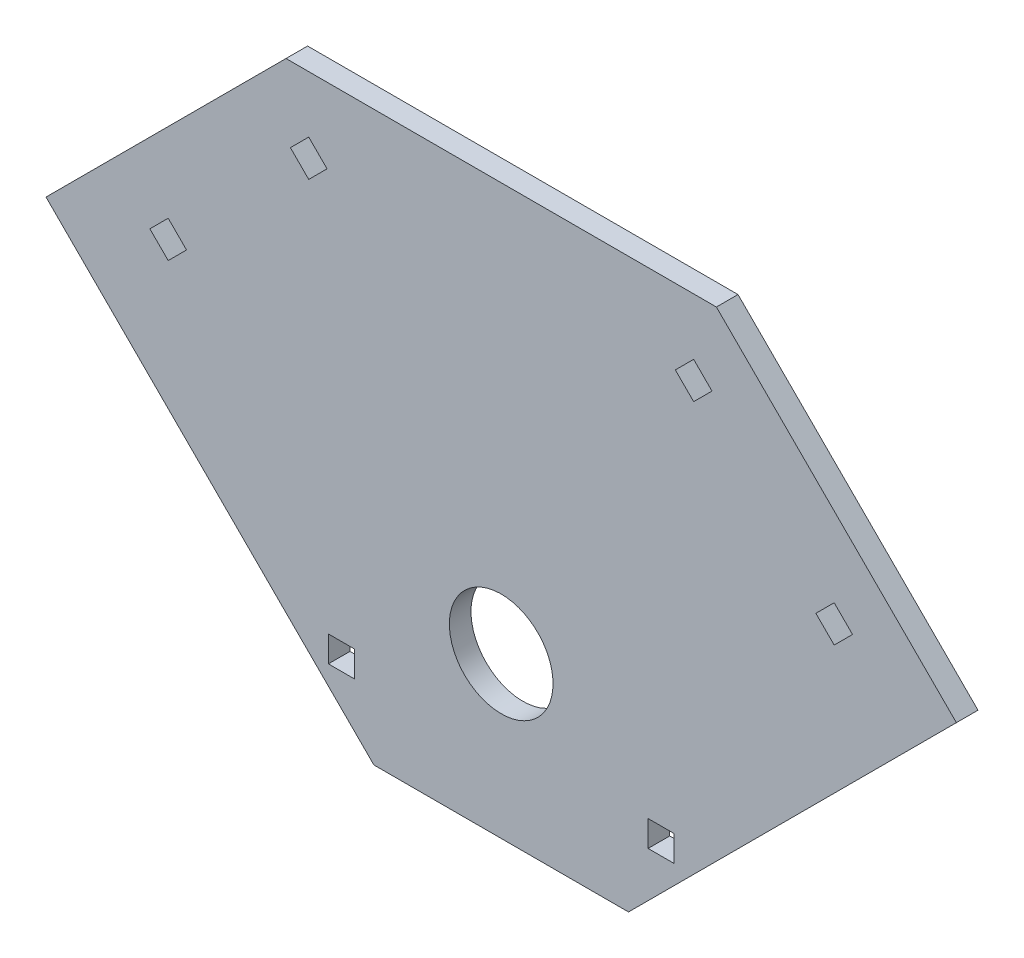
ISO-10303-21;
HEADER;
FILE_DESCRIPTION(('STEP AP214'),'2;1');
FILE_NAME('part.step','',(''),(''),'','','');
FILE_SCHEMA(('AUTOMOTIVE_DESIGN { 1 0 10303 214 1 1 1 1 }'));
ENDSEC;
DATA;
#1=APPLICATION_CONTEXT('core data for automotive mechanical design processes');
#2=APPLICATION_PROTOCOL_DEFINITION('international standard','automotive_design',2000,#1);
#3=PRODUCT_CONTEXT('',#1,'mechanical');
#4=PRODUCT('Part','Part','',(#3));
#5=PRODUCT_RELATED_PRODUCT_CATEGORY('part','',(#4));
#6=PRODUCT_DEFINITION_FORMATION('','',#4);
#7=PRODUCT_DEFINITION_CONTEXT('part definition',#1,'design');
#8=PRODUCT_DEFINITION('design','',#6,#7);
#9=PRODUCT_DEFINITION_SHAPE('','',#8);
#10=(LENGTH_UNIT() NAMED_UNIT(*) SI_UNIT(.MILLI.,.METRE.));
#11=(NAMED_UNIT(*) PLANE_ANGLE_UNIT() SI_UNIT($,.RADIAN.));
#12=(NAMED_UNIT(*) SI_UNIT($,.STERADIAN.) SOLID_ANGLE_UNIT());
#13=UNCERTAINTY_MEASURE_WITH_UNIT(LENGTH_MEASURE(1.E-05),#10,'distance_accuracy_value','');
#14=(GEOMETRIC_REPRESENTATION_CONTEXT(3) GLOBAL_UNCERTAINTY_ASSIGNED_CONTEXT((#13)) GLOBAL_UNIT_ASSIGNED_CONTEXT((#10,
#11,#12)) REPRESENTATION_CONTEXT('',''));
#15=CARTESIAN_POINT('',(0.,0.,0.));
#16=DIRECTION('',(0.,0.,1.));
#17=DIRECTION('',(1.,0.,0.));
#18=AXIS2_PLACEMENT_3D('',#15,#16,#17);
#19=CARTESIAN_POINT('',(0.,0.,5.));
#20=DIRECTION('',(0.,0.,-1.));
#21=DIRECTION('',(-1.,0.,0.));
#22=AXIS2_PLACEMENT_3D('',#19,#20,#21);
#23=PLANE('',#22);
#24=DIRECTION('',(0.,-1.,0.));
#25=VECTOR('',#24,1.);
#26=CARTESIAN_POINT('',(-40.,-22.,5.));
#27=LINE('',#26,#25);
#28=CARTESIAN_POINT('',(-40.,-16.,5.));
#29=VERTEX_POINT('',#28);
#30=CARTESIAN_POINT('',(-40.,-22.,5.));
#31=VERTEX_POINT('',#30);
#32=EDGE_CURVE('E263',#29,#31,#27,.T.);
#33=ORIENTED_EDGE('',*,*,#32,.F.);
#34=DIRECTION('',(-1.,0.,0.));
#35=VECTOR('',#34,1.);
#36=CARTESIAN_POINT('',(-40.,-16.,5.));
#37=LINE('',#36,#35);
#38=CARTESIAN_POINT('',(-34.,-16.,5.));
#39=VERTEX_POINT('',#38);
#40=EDGE_CURVE('E257',#39,#29,#37,.T.);
#41=ORIENTED_EDGE('',*,*,#40,.F.);
#42=DIRECTION('',(0.,1.,0.));
#43=VECTOR('',#42,1.);
#44=CARTESIAN_POINT('',(-34.,-22.,5.));
#45=LINE('',#44,#43);
#46=CARTESIAN_POINT('',(-34.,-22.,5.));
#47=VERTEX_POINT('',#46);
#48=EDGE_CURVE('E267',#47,#39,#45,.T.);
#49=ORIENTED_EDGE('',*,*,#48,.F.);
#50=DIRECTION('',(1.,0.,0.));
#51=VECTOR('',#50,1.);
#52=CARTESIAN_POINT('',(-40.,-22.,5.));
#53=LINE('',#52,#51);
#54=EDGE_CURVE('E56',#31,#47,#53,.T.);
#55=ORIENTED_EDGE('',*,*,#54,.F.);
#56=EDGE_LOOP('',(#33,#41,#49,#55));
#57=FACE_BOUND('',#56,.T.);
#58=DIRECTION('',(0.,-1.,0.));
#59=VECTOR('',#58,1.);
#60=CARTESIAN_POINT('',(34.,-22.,5.));
#61=LINE('',#60,#59);
#62=CARTESIAN_POINT('',(34.,-16.,5.));
#63=VERTEX_POINT('',#62);
#64=CARTESIAN_POINT('',(34.,-22.,5.));
#65=VERTEX_POINT('',#64);
#66=EDGE_CURVE('E304',#63,#65,#61,.T.);
#67=ORIENTED_EDGE('',*,*,#66,.F.);
#68=DIRECTION('',(-1.,0.,0.));
#69=VECTOR('',#68,1.);
#70=CARTESIAN_POINT('',(34.,-16.,5.));
#71=LINE('',#70,#69);
#72=CARTESIAN_POINT('',(40.,-16.,5.));
#73=VERTEX_POINT('',#72);
#74=EDGE_CURVE('E301',#73,#63,#71,.T.);
#75=ORIENTED_EDGE('',*,*,#74,.F.);
#76=DIRECTION('',(0.,1.,0.));
#77=VECTOR('',#76,1.);
#78=CARTESIAN_POINT('',(40.,-22.,5.));
#79=LINE('',#78,#77);
#80=CARTESIAN_POINT('',(40.,-22.,5.));
#81=VERTEX_POINT('',#80);
#82=EDGE_CURVE('E298',#81,#73,#79,.T.);
#83=ORIENTED_EDGE('',*,*,#82,.F.);
#84=DIRECTION('',(1.,0.,0.));
#85=VECTOR('',#84,1.);
#86=CARTESIAN_POINT('',(34.,-22.,5.));
#87=LINE('',#86,#85);
#88=EDGE_CURVE('E64',#65,#81,#87,.T.);
#89=ORIENTED_EDGE('',*,*,#88,.F.);
#90=EDGE_LOOP('',(#67,#75,#83,#89));
#91=FACE_BOUND('',#90,.T.);
#92=DIRECTION('',(-0.707106781186549,-0.707106781186546,0.));
#93=VECTOR('',#92,1.);
#94=CARTESIAN_POINT('',(44.5477272147526,81.3172798364529,5.));
#95=LINE('',#94,#93);
#96=CARTESIAN_POINT('',(44.5477272147526,81.3172798364529,5.));
#97=VERTEX_POINT('',#96);
#98=CARTESIAN_POINT('',(40.3050865276333,77.0746391493336,5.));
#99=VERTEX_POINT('',#98);
#100=EDGE_CURVE('E387',#97,#99,#95,.T.);
#101=ORIENTED_EDGE('',*,*,#100,.F.);
#102=DIRECTION('',(-0.707106781186546,0.707106781186549,0.));
#103=VECTOR('',#102,1.);
#104=CARTESIAN_POINT('',(48.7903679018719,77.0746391493336,5.));
#105=LINE('',#104,#103);
#106=CARTESIAN_POINT('',(48.7903679018719,77.0746391493336,5.));
#107=VERTEX_POINT('',#106);
#108=EDGE_CURVE('E395',#107,#97,#105,.T.);
#109=ORIENTED_EDGE('',*,*,#108,.F.);
#110=DIRECTION('',(0.70710678118655,0.707106781186545,0.));
#111=VECTOR('',#110,1.);
#112=CARTESIAN_POINT('',(44.5477272147526,72.8319984622143,5.));
#113=LINE('',#112,#111);
#114=CARTESIAN_POINT('',(44.5477272147526,72.8319984622143,5.));
#115=VERTEX_POINT('',#114);
#116=EDGE_CURVE('E392',#115,#107,#113,.T.);
#117=ORIENTED_EDGE('',*,*,#116,.F.);
#118=DIRECTION('',(0.707106781186547,-0.707106781186548,0.));
#119=VECTOR('',#118,1.);
#120=CARTESIAN_POINT('',(40.3050865276333,77.0746391493336,5.));
#121=LINE('',#120,#119);
#122=EDGE_CURVE('E389',#99,#115,#121,.T.);
#123=ORIENTED_EDGE('',*,*,#122,.F.);
#124=EDGE_LOOP('',(#101,#109,#117,#123));
#125=FACE_BOUND('',#124,.T.);
#126=DIRECTION('',(0.707106781186549,-0.707106781186546,0.));
#127=VECTOR('',#126,1.);
#128=CARTESIAN_POINT('',(-77.0746391493337,40.3050865276331,5.));
#129=LINE('',#128,#127);
#130=CARTESIAN_POINT('',(-81.317279836453,44.5477272147523,5.));
#131=VERTEX_POINT('',#130);
#132=CARTESIAN_POINT('',(-77.0746391493337,40.3050865276331,5.));
#133=VERTEX_POINT('',#132);
#134=EDGE_CURVE('E449',#131,#133,#129,.T.);
#135=ORIENTED_EDGE('',*,*,#134,.F.);
#136=DIRECTION('',(-0.707106781186546,-0.707106781186549,0.));
#137=VECTOR('',#136,1.);
#138=CARTESIAN_POINT('',(-81.317279836453,44.5477272147523,5.));
#139=LINE('',#138,#137);
#140=CARTESIAN_POINT('',(-77.0746391493338,48.7903679018716,5.));
#141=VERTEX_POINT('',#140);
#142=EDGE_CURVE('E457',#141,#131,#139,.T.);
#143=ORIENTED_EDGE('',*,*,#142,.F.);
#144=DIRECTION('',(-0.707106781186548,0.707106781186547,0.));
#145=VECTOR('',#144,1.);
#146=CARTESIAN_POINT('',(-77.0746391493338,48.7903679018716,5.));
#147=LINE('',#146,#145);
#148=CARTESIAN_POINT('',(-72.8319984622164,44.5477272147543,5.));
#149=VERTEX_POINT('',#148);
#150=EDGE_CURVE('E454',#149,#141,#147,.T.);
#151=ORIENTED_EDGE('',*,*,#150,.F.);
#152=DIRECTION('',(0.707106781186225,0.70710678118687,0.));
#153=VECTOR('',#152,1.);
#154=CARTESIAN_POINT('',(-72.8319984622164,44.5477272147543,5.));
#155=LINE('',#154,#153);
#156=EDGE_CURVE('E451',#133,#149,#155,.T.);
#157=ORIENTED_EDGE('',*,*,#156,.F.);
#158=EDGE_LOOP('',(#135,#143,#151,#157));
#159=FACE_BOUND('',#158,.T.);
#160=CARTESIAN_POINT('',(0.,0.,5.));
#161=DIRECTION('',(0.,0.,1.));
#162=DIRECTION('',(1.,0.,0.));
#163=AXIS2_PLACEMENT_3D('',#160,#161,#162);
#164=CIRCLE('',#163,12.);
#165=CARTESIAN_POINT('',(12.,0.,5.));
#166=VERTEX_POINT('',#165);
#167=EDGE_CURVE('E11',#166,#166,#164,.T.);
#168=ORIENTED_EDGE('',*,*,#167,.F.);
#169=EDGE_LOOP('',(#168));
#170=FACE_BOUND('',#169,.T.);
#171=DIRECTION('',(0.707106781186552,-0.707106781186543,0.));
#172=VECTOR('',#171,1.);
#173=CARTESIAN_POINT('',(-44.5477272147526,72.8319984622143,5.));
#174=LINE('',#173,#172);
#175=CARTESIAN_POINT('',(-48.7903679018719,77.0746391493336,5.));
#176=VERTEX_POINT('',#175);
#177=CARTESIAN_POINT('',(-44.5477272147526,72.8319984622143,5.));
#178=VERTEX_POINT('',#177);
#179=EDGE_CURVE('E418',#176,#178,#174,.T.);
#180=ORIENTED_EDGE('',*,*,#179,.F.);
#181=DIRECTION('',(-0.707106781186547,-0.707106781186547,0.));
#182=VECTOR('',#181,1.);
#183=CARTESIAN_POINT('',(-48.7903679018719,77.0746391493336,5.));
#184=LINE('',#183,#182);
#185=CARTESIAN_POINT('',(-44.5477272147526,81.3172798364529,5.));
#186=VERTEX_POINT('',#185);
#187=EDGE_CURVE('E426',#186,#176,#184,.T.);
#188=ORIENTED_EDGE('',*,*,#187,.F.);
#189=DIRECTION('',(-0.707106781186549,0.707106781186546,0.));
#190=VECTOR('',#189,1.);
#191=CARTESIAN_POINT('',(-44.5477272147526,81.3172798364529,5.));
#192=LINE('',#191,#190);
#193=CARTESIAN_POINT('',(-40.3050865276333,77.0746391493336,5.));
#194=VERTEX_POINT('',#193);
#195=EDGE_CURVE('E423',#194,#186,#192,.T.);
#196=ORIENTED_EDGE('',*,*,#195,.F.);
#197=DIRECTION('',(0.707106781186547,0.707106781186548,0.));
#198=VECTOR('',#197,1.);
#199=CARTESIAN_POINT('',(-40.3050865276333,77.0746391493336,5.));
#200=LINE('',#199,#198);
#201=EDGE_CURVE('E420',#178,#194,#200,.T.);
#202=ORIENTED_EDGE('',*,*,#201,.F.);
#203=EDGE_LOOP('',(#180,#188,#196,#202));
#204=FACE_BOUND('',#203,.T.);
#205=DIRECTION('',(-0.707106781186548,-0.707106781186547,0.));
#206=VECTOR('',#205,1.);
#207=CARTESIAN_POINT('',(77.0746391493338,48.7903679018716,5.));
#208=LINE('',#207,#206);
#209=CARTESIAN_POINT('',(77.0746391493338,48.7903679018716,5.));
#210=VERTEX_POINT('',#209);
#211=CARTESIAN_POINT('',(72.8319984622164,44.5477272147543,5.));
#212=VERTEX_POINT('',#211);
#213=EDGE_CURVE('E356',#210,#212,#208,.T.);
#214=ORIENTED_EDGE('',*,*,#213,.F.);
#215=DIRECTION('',(-0.707106781186546,0.707106781186549,0.));
#216=VECTOR('',#215,1.);
#217=CARTESIAN_POINT('',(81.317279836453,44.5477272147523,5.));
#218=LINE('',#217,#216);
#219=CARTESIAN_POINT('',(81.317279836453,44.5477272147523,5.));
#220=VERTEX_POINT('',#219);
#221=EDGE_CURVE('E364',#220,#210,#218,.T.);
#222=ORIENTED_EDGE('',*,*,#221,.F.);
#223=DIRECTION('',(0.707106781186549,0.707106781186546,0.));
#224=VECTOR('',#223,1.);
#225=CARTESIAN_POINT('',(77.0746391493337,40.3050865276331,5.));
#226=LINE('',#225,#224);
#227=CARTESIAN_POINT('',(77.0746391493337,40.3050865276331,5.));
#228=VERTEX_POINT('',#227);
#229=EDGE_CURVE('E361',#228,#220,#226,.T.);
#230=ORIENTED_EDGE('',*,*,#229,.F.);
#231=DIRECTION('',(0.707106781186227,-0.707106781186868,0.));
#232=VECTOR('',#231,1.);
#233=CARTESIAN_POINT('',(72.8319984622164,44.5477272147543,5.));
#234=LINE('',#233,#232);
#235=EDGE_CURVE('E358',#212,#228,#234,.T.);
#236=ORIENTED_EDGE('',*,*,#235,.F.);
#237=EDGE_LOOP('',(#214,#222,#230,#236));
#238=FACE_BOUND('',#237,.T.);
#239=DIRECTION('',(-1.,0.,0.));
#240=VECTOR('',#239,1.);
#241=CARTESIAN_POINT('',(-49.8111831820433,94.4386001800125,5.));
#242=LINE('',#241,#240);
#243=CARTESIAN_POINT('',(49.8111831820429,94.4386001800125,5.));
#244=VERTEX_POINT('',#243);
#245=CARTESIAN_POINT('',(-49.8111831820433,94.4386001800125,5.));
#246=VERTEX_POINT('',#245);
#247=EDGE_CURVE('E324',#244,#246,#242,.T.);
#248=ORIENTED_EDGE('',*,*,#247,.T.);
#249=DIRECTION('',(-0.707106781186546,-0.707106781186549,0.));
#250=VECTOR('',#249,1.);
#251=CARTESIAN_POINT('',(-105.358910396796,38.8908729652599,5.));
#252=LINE('',#251,#250);
#253=CARTESIAN_POINT('',(-105.358910396796,38.8908729652599,5.));
#254=VERTEX_POINT('',#253);
#255=EDGE_CURVE('E321',#246,#254,#252,.T.);
#256=ORIENTED_EDGE('',*,*,#255,.T.);
#257=DIRECTION('',(0.707106781186549,-0.707106781186546,0.));
#258=VECTOR('',#257,1.);
#259=CARTESIAN_POINT('',(-29.4680374315354,-37.,5.));
#260=LINE('',#259,#258);
#261=CARTESIAN_POINT('',(-29.4680374315354,-37.,5.));
#262=VERTEX_POINT('',#261);
#263=EDGE_CURVE('E318',#254,#262,#260,.T.);
#264=ORIENTED_EDGE('',*,*,#263,.T.);
#265=DIRECTION('',(1.,0.,0.));
#266=VECTOR('',#265,1.);
#267=CARTESIAN_POINT('',(29.4680374315355,-37.,5.));
#268=LINE('',#267,#266);
#269=CARTESIAN_POINT('',(29.4680374315355,-37.,5.));
#270=VERTEX_POINT('',#269);
#271=EDGE_CURVE('E315',#262,#270,#268,.T.);
#272=ORIENTED_EDGE('',*,*,#271,.T.);
#273=DIRECTION('',(0.707106781186546,0.707106781186549,0.));
#274=VECTOR('',#273,1.);
#275=CARTESIAN_POINT('',(105.358910396795,38.8908729652603,5.));
#276=LINE('',#275,#274);
#277=CARTESIAN_POINT('',(105.358910396795,38.8908729652603,5.));
#278=VERTEX_POINT('',#277);
#279=EDGE_CURVE('E312',#270,#278,#276,.T.);
#280=ORIENTED_EDGE('',*,*,#279,.T.);
#281=DIRECTION('',(-0.707106781186549,0.707106781186546,0.));
#282=VECTOR('',#281,1.);
#283=CARTESIAN_POINT('',(49.8111831820429,94.4386001800125,5.));
#284=LINE('',#283,#282);
#285=EDGE_CURVE('E308',#278,#244,#284,.T.);
#286=ORIENTED_EDGE('',*,*,#285,.T.);
#287=EDGE_LOOP('',(#248,#256,#264,#272,#280,#286));
#288=FACE_BOUND('',#287,.T.);
#289=ADVANCED_FACE('F41',(#57,#91,#125,#159,#170,#204,#238,#288),#23,.F.);
#290=CARTESIAN_POINT('',(0.,0.,0.));
#291=DIRECTION('',(0.,0.,-1.));
#292=DIRECTION('',(-1.,0.,0.));
#293=AXIS2_PLACEMENT_3D('',#290,#291,#292);
#294=PLANE('',#293);
#295=DIRECTION('',(-1.,0.,0.));
#296=VECTOR('',#295,1.);
#297=CARTESIAN_POINT('',(-40.,-16.,0.));
#298=LINE('',#297,#296);
#299=CARTESIAN_POINT('',(-34.,-16.,0.));
#300=VERTEX_POINT('',#299);
#301=CARTESIAN_POINT('',(-40.,-16.,0.));
#302=VERTEX_POINT('',#301);
#303=EDGE_CURVE('E254',#300,#302,#298,.T.);
#304=ORIENTED_EDGE('',*,*,#303,.T.);
#305=DIRECTION('',(0.,-1.,0.));
#306=VECTOR('',#305,1.);
#307=CARTESIAN_POINT('',(-40.,-22.,0.));
#308=LINE('',#307,#306);
#309=CARTESIAN_POINT('',(-40.,-22.,0.));
#310=VERTEX_POINT('',#309);
#311=EDGE_CURVE('E240',#302,#310,#308,.T.);
#312=ORIENTED_EDGE('',*,*,#311,.T.);
#313=DIRECTION('',(1.,0.,0.));
#314=VECTOR('',#313,1.);
#315=CARTESIAN_POINT('',(-40.,-22.,0.));
#316=LINE('',#315,#314);
#317=CARTESIAN_POINT('',(-34.,-22.,0.));
#318=VERTEX_POINT('',#317);
#319=EDGE_CURVE('E272',#310,#318,#316,.T.);
#320=ORIENTED_EDGE('',*,*,#319,.T.);
#321=DIRECTION('',(0.,1.,0.));
#322=VECTOR('',#321,1.);
#323=CARTESIAN_POINT('',(-34.,-22.,0.));
#324=LINE('',#323,#322);
#325=EDGE_CURVE('E261',#318,#300,#324,.T.);
#326=ORIENTED_EDGE('',*,*,#325,.T.);
#327=EDGE_LOOP('',(#304,#312,#320,#326));
#328=FACE_BOUND('',#327,.T.);
#329=DIRECTION('',(-1.,0.,0.));
#330=VECTOR('',#329,1.);
#331=CARTESIAN_POINT('',(34.,-16.,0.));
#332=LINE('',#331,#330);
#333=CARTESIAN_POINT('',(40.,-16.,0.));
#334=VERTEX_POINT('',#333);
#335=CARTESIAN_POINT('',(34.,-16.,0.));
#336=VERTEX_POINT('',#335);
#337=EDGE_CURVE('E283',#334,#336,#332,.T.);
#338=ORIENTED_EDGE('',*,*,#337,.T.);
#339=DIRECTION('',(0.,-1.,0.));
#340=VECTOR('',#339,1.);
#341=CARTESIAN_POINT('',(34.,-22.,0.));
#342=LINE('',#341,#340);
#343=CARTESIAN_POINT('',(34.,-22.,0.));
#344=VERTEX_POINT('',#343);
#345=EDGE_CURVE('E284',#336,#344,#342,.T.);
#346=ORIENTED_EDGE('',*,*,#345,.T.);
#347=DIRECTION('',(1.,0.,0.));
#348=VECTOR('',#347,1.);
#349=CARTESIAN_POINT('',(34.,-22.,0.));
#350=LINE('',#349,#348);
#351=CARTESIAN_POINT('',(40.,-22.,0.));
#352=VERTEX_POINT('',#351);
#353=EDGE_CURVE('E287',#344,#352,#350,.T.);
#354=ORIENTED_EDGE('',*,*,#353,.T.);
#355=DIRECTION('',(0.,1.,0.));
#356=VECTOR('',#355,1.);
#357=CARTESIAN_POINT('',(40.,-22.,0.));
#358=LINE('',#357,#356);
#359=EDGE_CURVE('E280',#352,#334,#358,.T.);
#360=ORIENTED_EDGE('',*,*,#359,.T.);
#361=EDGE_LOOP('',(#338,#346,#354,#360));
#362=FACE_BOUND('',#361,.T.);
#363=CARTESIAN_POINT('',(0.,0.,0.));
#364=DIRECTION('',(0.,0.,1.));
#365=DIRECTION('',(1.,0.,0.));
#366=AXIS2_PLACEMENT_3D('',#363,#364,#365);
#367=CIRCLE('',#366,12.);
#368=CARTESIAN_POINT('',(12.,0.,0.));
#369=VERTEX_POINT('',#368);
#370=EDGE_CURVE('E45',#369,#369,#367,.T.);
#371=ORIENTED_EDGE('',*,*,#370,.T.);
#372=EDGE_LOOP('',(#371));
#373=FACE_BOUND('',#372,.T.);
#374=DIRECTION('',(-0.707106781186546,-0.707106781186549,0.));
#375=VECTOR('',#374,1.);
#376=CARTESIAN_POINT('',(-81.317279836453,44.5477272147523,0.));
#377=LINE('',#376,#375);
#378=CARTESIAN_POINT('',(-77.0746391493338,48.7903679018716,0.));
#379=VERTEX_POINT('',#378);
#380=CARTESIAN_POINT('',(-81.317279836453,44.5477272147523,0.));
#381=VERTEX_POINT('',#380);
#382=EDGE_CURVE('E452',#379,#381,#377,.T.);
#383=ORIENTED_EDGE('',*,*,#382,.T.);
#384=DIRECTION('',(0.707106781186549,-0.707106781186546,0.));
#385=VECTOR('',#384,1.);
#386=CARTESIAN_POINT('',(-77.0746391493337,40.3050865276331,0.));
#387=LINE('',#386,#385);
#388=CARTESIAN_POINT('',(-77.0746391493337,40.3050865276331,0.));
#389=VERTEX_POINT('',#388);
#390=EDGE_CURVE('E448',#381,#389,#387,.T.);
#391=ORIENTED_EDGE('',*,*,#390,.T.);
#392=DIRECTION('',(0.707106781186225,0.70710678118687,0.));
#393=VECTOR('',#392,1.);
#394=CARTESIAN_POINT('',(-72.8319984622164,44.5477272147543,0.));
#395=LINE('',#394,#393);
#396=CARTESIAN_POINT('',(-72.8319984622164,44.5477272147543,0.));
#397=VERTEX_POINT('',#396);
#398=EDGE_CURVE('E462',#389,#397,#395,.T.);
#399=ORIENTED_EDGE('',*,*,#398,.T.);
#400=DIRECTION('',(-0.707106781186548,0.707106781186547,0.));
#401=VECTOR('',#400,1.);
#402=CARTESIAN_POINT('',(-77.0746391493338,48.7903679018716,0.));
#403=LINE('',#402,#401);
#404=EDGE_CURVE('E465',#397,#379,#403,.T.);
#405=ORIENTED_EDGE('',*,*,#404,.T.);
#406=EDGE_LOOP('',(#383,#391,#399,#405));
#407=FACE_BOUND('',#406,.T.);
#408=DIRECTION('',(-0.707106781186547,-0.707106781186547,0.));
#409=VECTOR('',#408,1.);
#410=CARTESIAN_POINT('',(-48.7903679018719,77.0746391493336,0.));
#411=LINE('',#410,#409);
#412=CARTESIAN_POINT('',(-44.5477272147526,81.3172798364529,0.));
#413=VERTEX_POINT('',#412);
#414=CARTESIAN_POINT('',(-48.7903679018719,77.0746391493336,0.));
#415=VERTEX_POINT('',#414);
#416=EDGE_CURVE('E421',#413,#415,#411,.T.);
#417=ORIENTED_EDGE('',*,*,#416,.T.);
#418=DIRECTION('',(0.707106781186552,-0.707106781186543,0.));
#419=VECTOR('',#418,1.);
#420=CARTESIAN_POINT('',(-44.5477272147526,72.8319984622143,0.));
#421=LINE('',#420,#419);
#422=CARTESIAN_POINT('',(-44.5477272147526,72.8319984622143,0.));
#423=VERTEX_POINT('',#422);
#424=EDGE_CURVE('E417',#415,#423,#421,.T.);
#425=ORIENTED_EDGE('',*,*,#424,.T.);
#426=DIRECTION('',(0.707106781186547,0.707106781186548,0.));
#427=VECTOR('',#426,1.);
#428=CARTESIAN_POINT('',(-40.3050865276333,77.0746391493336,0.));
#429=LINE('',#428,#427);
#430=CARTESIAN_POINT('',(-40.3050865276333,77.0746391493336,0.));
#431=VERTEX_POINT('',#430);
#432=EDGE_CURVE('E431',#423,#431,#429,.T.);
#433=ORIENTED_EDGE('',*,*,#432,.T.);
#434=DIRECTION('',(-0.707106781186549,0.707106781186546,0.));
#435=VECTOR('',#434,1.);
#436=CARTESIAN_POINT('',(-44.5477272147526,81.3172798364529,0.));
#437=LINE('',#436,#435);
#438=EDGE_CURVE('E434',#431,#413,#437,.T.);
#439=ORIENTED_EDGE('',*,*,#438,.T.);
#440=EDGE_LOOP('',(#417,#425,#433,#439));
#441=FACE_BOUND('',#440,.T.);
#442=DIRECTION('',(-0.707106781186546,0.707106781186549,0.));
#443=VECTOR('',#442,1.);
#444=CARTESIAN_POINT('',(48.7903679018719,77.0746391493336,0.));
#445=LINE('',#444,#443);
#446=CARTESIAN_POINT('',(48.7903679018719,77.0746391493336,0.));
#447=VERTEX_POINT('',#446);
#448=CARTESIAN_POINT('',(44.5477272147526,81.3172798364529,0.));
#449=VERTEX_POINT('',#448);
#450=EDGE_CURVE('E390',#447,#449,#445,.T.);
#451=ORIENTED_EDGE('',*,*,#450,.T.);
#452=DIRECTION('',(-0.707106781186549,-0.707106781186546,0.));
#453=VECTOR('',#452,1.);
#454=CARTESIAN_POINT('',(44.5477272147526,81.3172798364529,0.));
#455=LINE('',#454,#453);
#456=CARTESIAN_POINT('',(40.3050865276333,77.0746391493336,0.));
#457=VERTEX_POINT('',#456);
#458=EDGE_CURVE('E386',#449,#457,#455,.T.);
#459=ORIENTED_EDGE('',*,*,#458,.T.);
#460=DIRECTION('',(0.707106781186547,-0.707106781186548,0.));
#461=VECTOR('',#460,1.);
#462=CARTESIAN_POINT('',(40.3050865276333,77.0746391493336,0.));
#463=LINE('',#462,#461);
#464=CARTESIAN_POINT('',(44.5477272147526,72.8319984622143,0.));
#465=VERTEX_POINT('',#464);
#466=EDGE_CURVE('E400',#457,#465,#463,.T.);
#467=ORIENTED_EDGE('',*,*,#466,.T.);
#468=DIRECTION('',(0.70710678118655,0.707106781186545,0.));
#469=VECTOR('',#468,1.);
#470=CARTESIAN_POINT('',(44.5477272147526,72.8319984622143,0.));
#471=LINE('',#470,#469);
#472=EDGE_CURVE('E403',#465,#447,#471,.T.);
#473=ORIENTED_EDGE('',*,*,#472,.T.);
#474=EDGE_LOOP('',(#451,#459,#467,#473));
#475=FACE_BOUND('',#474,.T.);
#476=DIRECTION('',(-0.707106781186546,0.707106781186549,0.));
#477=VECTOR('',#476,1.);
#478=CARTESIAN_POINT('',(81.317279836453,44.5477272147523,0.));
#479=LINE('',#478,#477);
#480=CARTESIAN_POINT('',(81.317279836453,44.5477272147523,0.));
#481=VERTEX_POINT('',#480);
#482=CARTESIAN_POINT('',(77.0746391493338,48.7903679018716,0.));
#483=VERTEX_POINT('',#482);
#484=EDGE_CURVE('E359',#481,#483,#479,.T.);
#485=ORIENTED_EDGE('',*,*,#484,.T.);
#486=DIRECTION('',(-0.707106781186548,-0.707106781186547,0.));
#487=VECTOR('',#486,1.);
#488=CARTESIAN_POINT('',(77.0746391493338,48.7903679018716,0.));
#489=LINE('',#488,#487);
#490=CARTESIAN_POINT('',(72.8319984622164,44.5477272147543,0.));
#491=VERTEX_POINT('',#490);
#492=EDGE_CURVE('E311',#483,#491,#489,.T.);
#493=ORIENTED_EDGE('',*,*,#492,.T.);
#494=DIRECTION('',(0.707106781186227,-0.707106781186868,0.));
#495=VECTOR('',#494,1.);
#496=CARTESIAN_POINT('',(72.8319984622164,44.5477272147543,0.));
#497=LINE('',#496,#495);
#498=CARTESIAN_POINT('',(77.0746391493337,40.3050865276331,0.));
#499=VERTEX_POINT('',#498);
#500=EDGE_CURVE('E369',#491,#499,#497,.T.);
#501=ORIENTED_EDGE('',*,*,#500,.T.);
#502=DIRECTION('',(0.707106781186549,0.707106781186546,0.));
#503=VECTOR('',#502,1.);
#504=CARTESIAN_POINT('',(77.0746391493337,40.3050865276331,0.));
#505=LINE('',#504,#503);
#506=EDGE_CURVE('E372',#499,#481,#505,.T.);
#507=ORIENTED_EDGE('',*,*,#506,.T.);
#508=EDGE_LOOP('',(#485,#493,#501,#507));
#509=FACE_BOUND('',#508,.T.);
#510=DIRECTION('',(-1.,0.,0.));
#511=VECTOR('',#510,1.);
#512=CARTESIAN_POINT('',(-49.8111831820433,94.4386001800125,0.));
#513=LINE('',#512,#511);
#514=CARTESIAN_POINT('',(49.8111831820429,94.4386001800125,0.));
#515=VERTEX_POINT('',#514);
#516=CARTESIAN_POINT('',(-49.8111831820433,94.4386001800125,0.));
#517=VERTEX_POINT('',#516);
#518=EDGE_CURVE('E277',#515,#517,#513,.T.);
#519=ORIENTED_EDGE('',*,*,#518,.F.);
#520=DIRECTION('',(-0.707106781186549,0.707106781186546,0.));
#521=VECTOR('',#520,1.);
#522=CARTESIAN_POINT('',(49.8111831820429,94.4386001800125,0.));
#523=LINE('',#522,#521);
#524=CARTESIAN_POINT('',(105.358910396795,38.8908729652603,0.));
#525=VERTEX_POINT('',#524);
#526=EDGE_CURVE('E335',#525,#515,#523,.T.);
#527=ORIENTED_EDGE('',*,*,#526,.F.);
#528=DIRECTION('',(0.707106781186546,0.707106781186549,0.));
#529=VECTOR('',#528,1.);
#530=CARTESIAN_POINT('',(105.358910396795,38.8908729652603,0.));
#531=LINE('',#530,#529);
#532=CARTESIAN_POINT('',(29.4680374315355,-37.,0.));
#533=VERTEX_POINT('',#532);
#534=EDGE_CURVE('E339',#533,#525,#531,.T.);
#535=ORIENTED_EDGE('',*,*,#534,.F.);
#536=DIRECTION('',(1.,0.,0.));
#537=VECTOR('',#536,1.);
#538=CARTESIAN_POINT('',(29.4680374315355,-37.,0.));
#539=LINE('',#538,#537);
#540=CARTESIAN_POINT('',(-29.4680374315354,-37.,0.));
#541=VERTEX_POINT('',#540);
#542=EDGE_CURVE('E343',#541,#533,#539,.T.);
#543=ORIENTED_EDGE('',*,*,#542,.F.);
#544=DIRECTION('',(0.707106781186549,-0.707106781186546,0.));
#545=VECTOR('',#544,1.);
#546=CARTESIAN_POINT('',(-29.4680374315354,-37.,0.));
#547=LINE('',#546,#545);
#548=CARTESIAN_POINT('',(-105.358910396796,38.8908729652599,0.));
#549=VERTEX_POINT('',#548);
#550=EDGE_CURVE('E347',#549,#541,#547,.T.);
#551=ORIENTED_EDGE('',*,*,#550,.F.);
#552=DIRECTION('',(-0.707106781186546,-0.707106781186549,0.));
#553=VECTOR('',#552,1.);
#554=CARTESIAN_POINT('',(-105.358910396796,38.8908729652599,0.));
#555=LINE('',#554,#553);
#556=EDGE_CURVE('E328',#517,#549,#555,.T.);
#557=ORIENTED_EDGE('',*,*,#556,.F.);
#558=EDGE_LOOP('',(#519,#527,#535,#543,#551,#557));
#559=FACE_BOUND('',#558,.T.);
#560=ADVANCED_FACE('F43',(#328,#362,#373,#407,#441,#475,#509,#559),#294,.T.);
#561=CARTESIAN_POINT('',(0.,0.,5.));
#562=DIRECTION('',(0.,0.,-1.));
#563=DIRECTION('',(-1.,0.,0.));
#564=AXIS2_PLACEMENT_3D('',#561,#562,#563);
#565=CYLINDRICAL_SURFACE('',#564,12.);
#566=ORIENTED_EDGE('',*,*,#167,.T.);
#567=EDGE_LOOP('',(#566));
#568=FACE_BOUND('',#567,.T.);
#569=ORIENTED_EDGE('',*,*,#370,.F.);
#570=EDGE_LOOP('',(#569));
#571=FACE_BOUND('',#570,.T.);
#572=ADVANCED_FACE('F485',(#568,#571),#565,.F.);
#573=CARTESIAN_POINT('',(-77.0746391493337,40.3050865276331,5.));
#574=DIRECTION('',(0.707106781186546,0.707106781186549,0.));
#575=DIRECTION('',(-0.707106781186549,0.707106781186546,0.));
#576=AXIS2_PLACEMENT_3D('',#573,#574,#575);
#577=PLANE('',#576);
#578=ORIENTED_EDGE('',*,*,#390,.F.);
#579=DIRECTION('',(0.,0.,-1.));
#580=VECTOR('',#579,1.);
#581=CARTESIAN_POINT('',(-81.317279836453,44.5477272147523,5.));
#582=LINE('',#581,#580);
#583=EDGE_CURVE('E459',#131,#381,#582,.T.);
#584=ORIENTED_EDGE('',*,*,#583,.F.);
#585=ORIENTED_EDGE('',*,*,#134,.T.);
#586=DIRECTION('',(0.,0.,-1.));
#587=VECTOR('',#586,1.);
#588=CARTESIAN_POINT('',(-77.0746391493337,40.3050865276331,5.));
#589=LINE('',#588,#587);
#590=EDGE_CURVE('E476',#133,#389,#589,.T.);
#591=ORIENTED_EDGE('',*,*,#590,.T.);
#592=EDGE_LOOP('',(#578,#584,#585,#591));
#593=FACE_BOUND('',#592,.T.);
#594=ADVANCED_FACE('F487',(#593),#577,.T.);
#595=CARTESIAN_POINT('',(-72.8319984622164,44.5477272147543,5.));
#596=DIRECTION('',(-0.70710678118687,0.707106781186225,0.));
#597=DIRECTION('',(-0.707106781186225,-0.70710678118687,0.));
#598=AXIS2_PLACEMENT_3D('',#595,#596,#597);
#599=PLANE('',#598);
#600=ORIENTED_EDGE('',*,*,#398,.F.);
#601=ORIENTED_EDGE('',*,*,#590,.F.);
#602=ORIENTED_EDGE('',*,*,#156,.T.);
#603=DIRECTION('',(0.,0.,-1.));
#604=VECTOR('',#603,1.);
#605=CARTESIAN_POINT('',(-72.8319984622164,44.5477272147543,5.));
#606=LINE('',#605,#604);
#607=EDGE_CURVE('E474',#149,#397,#606,.T.);
#608=ORIENTED_EDGE('',*,*,#607,.T.);
#609=EDGE_LOOP('',(#600,#601,#602,#608));
#610=FACE_BOUND('',#609,.T.);
#611=ADVANCED_FACE('F493',(#610),#599,.T.);
#612=CARTESIAN_POINT('',(-77.0746391493338,48.7903679018716,5.));
#613=DIRECTION('',(-0.707106781186547,-0.707106781186548,0.));
#614=DIRECTION('',(0.707106781186548,-0.707106781186547,0.));
#615=AXIS2_PLACEMENT_3D('',#612,#613,#614);
#616=PLANE('',#615);
#617=ORIENTED_EDGE('',*,*,#404,.F.);
#618=ORIENTED_EDGE('',*,*,#607,.F.);
#619=ORIENTED_EDGE('',*,*,#150,.T.);
#620=DIRECTION('',(0.,0.,-1.));
#621=VECTOR('',#620,1.);
#622=CARTESIAN_POINT('',(-77.0746391493338,48.7903679018716,5.));
#623=LINE('',#622,#621);
#624=EDGE_CURVE('E472',#141,#379,#623,.T.);
#625=ORIENTED_EDGE('',*,*,#624,.T.);
#626=EDGE_LOOP('',(#617,#618,#619,#625));
#627=FACE_BOUND('',#626,.T.);
#628=ADVANCED_FACE('F609',(#627),#616,.T.);
#629=CARTESIAN_POINT('',(-81.317279836453,44.5477272147523,5.));
#630=DIRECTION('',(0.707106781186549,-0.707106781186546,0.));
#631=DIRECTION('',(0.707106781186546,0.707106781186549,0.));
#632=AXIS2_PLACEMENT_3D('',#629,#630,#631);
#633=PLANE('',#632);
#634=ORIENTED_EDGE('',*,*,#382,.F.);
#635=ORIENTED_EDGE('',*,*,#624,.F.);
#636=ORIENTED_EDGE('',*,*,#142,.T.);
#637=ORIENTED_EDGE('',*,*,#583,.T.);
#638=EDGE_LOOP('',(#634,#635,#636,#637));
#639=FACE_BOUND('',#638,.T.);
#640=ADVANCED_FACE('F605',(#639),#633,.T.);
#641=CARTESIAN_POINT('',(-44.5477272147526,72.8319984622143,5.));
#642=DIRECTION('',(0.707106781186543,0.707106781186552,0.));
#643=DIRECTION('',(-0.707106781186552,0.707106781186543,0.));
#644=AXIS2_PLACEMENT_3D('',#641,#642,#643);
#645=PLANE('',#644);
#646=ORIENTED_EDGE('',*,*,#424,.F.);
#647=DIRECTION('',(0.,0.,-1.));
#648=VECTOR('',#647,1.);
#649=CARTESIAN_POINT('',(-48.7903679018719,77.0746391493336,5.));
#650=LINE('',#649,#648);
#651=EDGE_CURVE('E428',#176,#415,#650,.T.);
#652=ORIENTED_EDGE('',*,*,#651,.F.);
#653=ORIENTED_EDGE('',*,*,#179,.T.);
#654=DIRECTION('',(0.,0.,-1.));
#655=VECTOR('',#654,1.);
#656=CARTESIAN_POINT('',(-44.5477272147526,72.8319984622143,5.));
#657=LINE('',#656,#655);
#658=EDGE_CURVE('E445',#178,#423,#657,.T.);
#659=ORIENTED_EDGE('',*,*,#658,.T.);
#660=EDGE_LOOP('',(#646,#652,#653,#659));
#661=FACE_BOUND('',#660,.T.);
#662=ADVANCED_FACE('F601',(#661),#645,.T.);
#663=CARTESIAN_POINT('',(-40.3050865276333,77.0746391493336,5.));
#664=DIRECTION('',(-0.707106781186548,0.707106781186547,0.));
#665=DIRECTION('',(-0.707106781186547,-0.707106781186548,0.));
#666=AXIS2_PLACEMENT_3D('',#663,#664,#665);
#667=PLANE('',#666);
#668=ORIENTED_EDGE('',*,*,#432,.F.);
#669=ORIENTED_EDGE('',*,*,#658,.F.);
#670=ORIENTED_EDGE('',*,*,#201,.T.);
#671=DIRECTION('',(0.,0.,-1.));
#672=VECTOR('',#671,1.);
#673=CARTESIAN_POINT('',(-40.3050865276333,77.0746391493336,5.));
#674=LINE('',#673,#672);
#675=EDGE_CURVE('E443',#194,#431,#674,.T.);
#676=ORIENTED_EDGE('',*,*,#675,.T.);
#677=EDGE_LOOP('',(#668,#669,#670,#676));
#678=FACE_BOUND('',#677,.T.);
#679=ADVANCED_FACE('F597',(#678),#667,.T.);
#680=CARTESIAN_POINT('',(-44.5477272147526,81.3172798364529,5.));
#681=DIRECTION('',(-0.707106781186546,-0.707106781186549,0.));
#682=DIRECTION('',(0.707106781186549,-0.707106781186546,0.));
#683=AXIS2_PLACEMENT_3D('',#680,#681,#682);
#684=PLANE('',#683);
#685=ORIENTED_EDGE('',*,*,#438,.F.);
#686=ORIENTED_EDGE('',*,*,#675,.F.);
#687=ORIENTED_EDGE('',*,*,#195,.T.);
#688=DIRECTION('',(0.,0.,-1.));
#689=VECTOR('',#688,1.);
#690=CARTESIAN_POINT('',(-44.5477272147526,81.3172798364529,5.));
#691=LINE('',#690,#689);
#692=EDGE_CURVE('E441',#186,#413,#691,.T.);
#693=ORIENTED_EDGE('',*,*,#692,.T.);
#694=EDGE_LOOP('',(#685,#686,#687,#693));
#695=FACE_BOUND('',#694,.T.);
#696=ADVANCED_FACE('F593',(#695),#684,.T.);
#697=CARTESIAN_POINT('',(-48.7903679018719,77.0746391493336,5.));
#698=DIRECTION('',(0.707106781186548,-0.707106781186548,0.));
#699=DIRECTION('',(0.707106781186548,0.707106781186548,0.));
#700=AXIS2_PLACEMENT_3D('',#697,#698,#699);
#701=PLANE('',#700);
#702=ORIENTED_EDGE('',*,*,#416,.F.);
#703=ORIENTED_EDGE('',*,*,#692,.F.);
#704=ORIENTED_EDGE('',*,*,#187,.T.);
#705=ORIENTED_EDGE('',*,*,#651,.T.);
#706=EDGE_LOOP('',(#702,#703,#704,#705));
#707=FACE_BOUND('',#706,.T.);
#708=ADVANCED_FACE('F589',(#707),#701,.T.);
#709=CARTESIAN_POINT('',(44.5477272147526,81.3172798364529,5.));
#710=DIRECTION('',(0.707106781186546,-0.707106781186549,0.));
#711=DIRECTION('',(0.707106781186549,0.707106781186546,0.));
#712=AXIS2_PLACEMENT_3D('',#709,#710,#711);
#713=PLANE('',#712);
#714=ORIENTED_EDGE('',*,*,#458,.F.);
#715=DIRECTION('',(0.,0.,-1.));
#716=VECTOR('',#715,1.);
#717=CARTESIAN_POINT('',(44.5477272147526,81.3172798364529,5.));
#718=LINE('',#717,#716);
#719=EDGE_CURVE('E397',#97,#449,#718,.T.);
#720=ORIENTED_EDGE('',*,*,#719,.F.);
#721=ORIENTED_EDGE('',*,*,#100,.T.);
#722=DIRECTION('',(0.,0.,-1.));
#723=VECTOR('',#722,1.);
#724=CARTESIAN_POINT('',(40.3050865276333,77.0746391493336,5.));
#725=LINE('',#724,#723);
#726=EDGE_CURVE('E414',#99,#457,#725,.T.);
#727=ORIENTED_EDGE('',*,*,#726,.T.);
#728=EDGE_LOOP('',(#714,#720,#721,#727));
#729=FACE_BOUND('',#728,.T.);
#730=ADVANCED_FACE('F585',(#729),#713,.T.);
#731=CARTESIAN_POINT('',(40.3050865276333,77.0746391493336,5.));
#732=DIRECTION('',(0.707106781186548,0.707106781186547,0.));
#733=DIRECTION('',(-0.707106781186547,0.707106781186548,0.));
#734=AXIS2_PLACEMENT_3D('',#731,#732,#733);
#735=PLANE('',#734);
#736=ORIENTED_EDGE('',*,*,#466,.F.);
#737=ORIENTED_EDGE('',*,*,#726,.F.);
#738=ORIENTED_EDGE('',*,*,#122,.T.);
#739=DIRECTION('',(0.,0.,-1.));
#740=VECTOR('',#739,1.);
#741=CARTESIAN_POINT('',(44.5477272147526,72.8319984622143,5.));
#742=LINE('',#741,#740);
#743=EDGE_CURVE('E412',#115,#465,#742,.T.);
#744=ORIENTED_EDGE('',*,*,#743,.T.);
#745=EDGE_LOOP('',(#736,#737,#738,#744));
#746=FACE_BOUND('',#745,.T.);
#747=ADVANCED_FACE('F581',(#746),#735,.T.);
#748=CARTESIAN_POINT('',(44.5477272147526,72.8319984622143,5.));
#749=DIRECTION('',(-0.707106781186545,0.70710678118655,0.));
#750=DIRECTION('',(-0.70710678118655,-0.707106781186545,0.));
#751=AXIS2_PLACEMENT_3D('',#748,#749,#750);
#752=PLANE('',#751);
#753=ORIENTED_EDGE('',*,*,#472,.F.);
#754=ORIENTED_EDGE('',*,*,#743,.F.);
#755=ORIENTED_EDGE('',*,*,#116,.T.);
#756=DIRECTION('',(0.,0.,-1.));
#757=VECTOR('',#756,1.);
#758=CARTESIAN_POINT('',(48.7903679018719,77.0746391493336,5.));
#759=LINE('',#758,#757);
#760=EDGE_CURVE('E410',#107,#447,#759,.T.);
#761=ORIENTED_EDGE('',*,*,#760,.T.);
#762=EDGE_LOOP('',(#753,#754,#755,#761));
#763=FACE_BOUND('',#762,.T.);
#764=ADVANCED_FACE('F577',(#763),#752,.T.);
#765=CARTESIAN_POINT('',(48.7903679018719,77.0746391493336,5.));
#766=DIRECTION('',(-0.707106781186549,-0.707106781186546,0.));
#767=DIRECTION('',(0.707106781186546,-0.707106781186549,0.));
#768=AXIS2_PLACEMENT_3D('',#765,#766,#767);
#769=PLANE('',#768);
#770=ORIENTED_EDGE('',*,*,#450,.F.);
#771=ORIENTED_EDGE('',*,*,#760,.F.);
#772=ORIENTED_EDGE('',*,*,#108,.T.);
#773=ORIENTED_EDGE('',*,*,#719,.T.);
#774=EDGE_LOOP('',(#770,#771,#772,#773));
#775=FACE_BOUND('',#774,.T.);
#776=ADVANCED_FACE('F573',(#775),#769,.T.);
#777=CARTESIAN_POINT('',(77.0746391493338,48.7903679018716,5.));
#778=DIRECTION('',(0.707106781186547,-0.707106781186548,0.));
#779=DIRECTION('',(0.707106781186548,0.707106781186547,0.));
#780=AXIS2_PLACEMENT_3D('',#777,#778,#779);
#781=PLANE('',#780);
#782=ORIENTED_EDGE('',*,*,#492,.F.);
#783=DIRECTION('',(0.,0.,-1.));
#784=VECTOR('',#783,1.);
#785=CARTESIAN_POINT('',(77.0746391493338,48.7903679018716,5.));
#786=LINE('',#785,#784);
#787=EDGE_CURVE('E366',#210,#483,#786,.T.);
#788=ORIENTED_EDGE('',*,*,#787,.F.);
#789=ORIENTED_EDGE('',*,*,#213,.T.);
#790=DIRECTION('',(0.,0.,-1.));
#791=VECTOR('',#790,1.);
#792=CARTESIAN_POINT('',(72.8319984622164,44.5477272147543,5.));
#793=LINE('',#792,#791);
#794=EDGE_CURVE('E383',#212,#491,#793,.T.);
#795=ORIENTED_EDGE('',*,*,#794,.T.);
#796=EDGE_LOOP('',(#782,#788,#789,#795));
#797=FACE_BOUND('',#796,.T.);
#798=ADVANCED_FACE('F569',(#797),#781,.T.);
#799=CARTESIAN_POINT('',(72.8319984622164,44.5477272147543,5.));
#800=DIRECTION('',(0.707106781186868,0.707106781186227,0.));
#801=DIRECTION('',(-0.707106781186227,0.707106781186868,0.));
#802=AXIS2_PLACEMENT_3D('',#799,#800,#801);
#803=PLANE('',#802);
#804=ORIENTED_EDGE('',*,*,#500,.F.);
#805=ORIENTED_EDGE('',*,*,#794,.F.);
#806=ORIENTED_EDGE('',*,*,#235,.T.);
#807=DIRECTION('',(0.,0.,-1.));
#808=VECTOR('',#807,1.);
#809=CARTESIAN_POINT('',(77.0746391493337,40.3050865276331,5.));
#810=LINE('',#809,#808);
#811=EDGE_CURVE('E381',#228,#499,#810,.T.);
#812=ORIENTED_EDGE('',*,*,#811,.T.);
#813=EDGE_LOOP('',(#804,#805,#806,#812));
#814=FACE_BOUND('',#813,.T.);
#815=ADVANCED_FACE('F565',(#814),#803,.T.);
#816=CARTESIAN_POINT('',(77.0746391493337,40.3050865276331,5.));
#817=DIRECTION('',(-0.707106781186546,0.707106781186549,0.));
#818=DIRECTION('',(-0.707106781186549,-0.707106781186546,0.));
#819=AXIS2_PLACEMENT_3D('',#816,#817,#818);
#820=PLANE('',#819);
#821=ORIENTED_EDGE('',*,*,#506,.F.);
#822=ORIENTED_EDGE('',*,*,#811,.F.);
#823=ORIENTED_EDGE('',*,*,#229,.T.);
#824=DIRECTION('',(0.,0.,-1.));
#825=VECTOR('',#824,1.);
#826=CARTESIAN_POINT('',(81.317279836453,44.5477272147523,5.));
#827=LINE('',#826,#825);
#828=EDGE_CURVE('E379',#220,#481,#827,.T.);
#829=ORIENTED_EDGE('',*,*,#828,.T.);
#830=EDGE_LOOP('',(#821,#822,#823,#829));
#831=FACE_BOUND('',#830,.T.);
#832=ADVANCED_FACE('F561',(#831),#820,.T.);
#833=CARTESIAN_POINT('',(81.317279836453,44.5477272147523,5.));
#834=DIRECTION('',(-0.707106781186549,-0.707106781186546,0.));
#835=DIRECTION('',(0.707106781186546,-0.707106781186549,0.));
#836=AXIS2_PLACEMENT_3D('',#833,#834,#835);
#837=PLANE('',#836);
#838=ORIENTED_EDGE('',*,*,#484,.F.);
#839=ORIENTED_EDGE('',*,*,#828,.F.);
#840=ORIENTED_EDGE('',*,*,#221,.T.);
#841=ORIENTED_EDGE('',*,*,#787,.T.);
#842=EDGE_LOOP('',(#838,#839,#840,#841));
#843=FACE_BOUND('',#842,.T.);
#844=ADVANCED_FACE('F555',(#843),#837,.T.);
#845=CARTESIAN_POINT('',(-49.8111831820433,94.4386001800125,-248.350771324111));
#846=DIRECTION('',(0.,1.,0.));
#847=DIRECTION('',(0.,0.,1.));
#848=AXIS2_PLACEMENT_3D('',#845,#846,#847);
#849=PLANE('',#848);
#850=DIRECTION('',(0.,0.,1.));
#851=VECTOR('',#850,1.);
#852=CARTESIAN_POINT('',(49.8111831820429,94.4386001800125,-248.350771324111));
#853=LINE('',#852,#851);
#854=EDGE_CURVE('E338',#515,#244,#853,.T.);
#855=ORIENTED_EDGE('',*,*,#854,.F.);
#856=ORIENTED_EDGE('',*,*,#518,.T.);
#857=DIRECTION('',(0.,0.,1.));
#858=VECTOR('',#857,1.);
#859=CARTESIAN_POINT('',(-49.8111831820433,94.4386001800125,-248.350771324111));
#860=LINE('',#859,#858);
#861=EDGE_CURVE('E334',#517,#246,#860,.T.);
#862=ORIENTED_EDGE('',*,*,#861,.T.);
#863=ORIENTED_EDGE('',*,*,#247,.F.);
#864=EDGE_LOOP('',(#855,#856,#862,#863));
#865=FACE_BOUND('',#864,.T.);
#866=ADVANCED_FACE('F528',(#865),#849,.T.);
#867=CARTESIAN_POINT('',(49.8111831820429,94.4386001800125,-248.350771324111));
#868=DIRECTION('',(0.707106781186546,0.707106781186549,0.));
#869=DIRECTION('',(-0.707106781186549,0.707106781186546,0.));
#870=AXIS2_PLACEMENT_3D('',#867,#868,#869);
#871=PLANE('',#870);
#872=DIRECTION('',(0.,0.,1.));
#873=VECTOR('',#872,1.);
#874=CARTESIAN_POINT('',(105.358910396795,38.8908729652603,-248.350771324111));
#875=LINE('',#874,#873);
#876=EDGE_CURVE('E342',#525,#278,#875,.T.);
#877=ORIENTED_EDGE('',*,*,#876,.F.);
#878=ORIENTED_EDGE('',*,*,#526,.T.);
#879=ORIENTED_EDGE('',*,*,#854,.T.);
#880=ORIENTED_EDGE('',*,*,#285,.F.);
#881=EDGE_LOOP('',(#877,#878,#879,#880));
#882=FACE_BOUND('',#881,.T.);
#883=ADVANCED_FACE('F546',(#882),#871,.T.);
#884=CARTESIAN_POINT('',(105.358910396795,38.8908729652603,-248.350771324111));
#885=DIRECTION('',(0.707106781186549,-0.707106781186546,0.));
#886=DIRECTION('',(0.707106781186546,0.707106781186549,0.));
#887=AXIS2_PLACEMENT_3D('',#884,#885,#886);
#888=PLANE('',#887);
#889=DIRECTION('',(0.,0.,1.));
#890=VECTOR('',#889,1.);
#891=CARTESIAN_POINT('',(29.4680374315355,-37.,-248.350771324111));
#892=LINE('',#891,#890);
#893=EDGE_CURVE('E346',#533,#270,#892,.T.);
#894=ORIENTED_EDGE('',*,*,#893,.F.);
#895=ORIENTED_EDGE('',*,*,#534,.T.);
#896=ORIENTED_EDGE('',*,*,#876,.T.);
#897=ORIENTED_EDGE('',*,*,#279,.F.);
#898=EDGE_LOOP('',(#894,#895,#896,#897));
#899=FACE_BOUND('',#898,.T.);
#900=ADVANCED_FACE('F543',(#899),#888,.T.);
#901=CARTESIAN_POINT('',(29.4680374315355,-37.,-248.350771324111));
#902=DIRECTION('',(0.,-1.,0.));
#903=DIRECTION('',(1.,0.,0.));
#904=AXIS2_PLACEMENT_3D('',#901,#902,#903);
#905=PLANE('',#904);
#906=DIRECTION('',(0.,0.,1.));
#907=VECTOR('',#906,1.);
#908=CARTESIAN_POINT('',(-29.4680374315354,-37.,-248.350771324111));
#909=LINE('',#908,#907);
#910=EDGE_CURVE('E331',#541,#262,#909,.T.);
#911=ORIENTED_EDGE('',*,*,#910,.F.);
#912=ORIENTED_EDGE('',*,*,#542,.T.);
#913=ORIENTED_EDGE('',*,*,#893,.T.);
#914=ORIENTED_EDGE('',*,*,#271,.F.);
#915=EDGE_LOOP('',(#911,#912,#913,#914));
#916=FACE_BOUND('',#915,.T.);
#917=ADVANCED_FACE('F540',(#916),#905,.T.);
#918=CARTESIAN_POINT('',(-29.4680374315354,-37.,-248.350771324111));
#919=DIRECTION('',(-0.707106781186546,-0.707106781186549,0.));
#920=DIRECTION('',(0.707106781186549,-0.707106781186546,0.));
#921=AXIS2_PLACEMENT_3D('',#918,#919,#920);
#922=PLANE('',#921);
#923=DIRECTION('',(0.,0.,1.));
#924=VECTOR('',#923,1.);
#925=CARTESIAN_POINT('',(-105.358910396796,38.8908729652599,-248.350771324111));
#926=LINE('',#925,#924);
#927=EDGE_CURVE('E327',#549,#254,#926,.T.);
#928=ORIENTED_EDGE('',*,*,#927,.F.);
#929=ORIENTED_EDGE('',*,*,#550,.T.);
#930=ORIENTED_EDGE('',*,*,#910,.T.);
#931=ORIENTED_EDGE('',*,*,#263,.F.);
#932=EDGE_LOOP('',(#928,#929,#930,#931));
#933=FACE_BOUND('',#932,.T.);
#934=ADVANCED_FACE('F535',(#933),#922,.T.);
#935=CARTESIAN_POINT('',(-105.358910396796,38.8908729652599,-248.350771324111));
#936=DIRECTION('',(-0.707106781186549,0.707106781186546,0.));
#937=DIRECTION('',(-0.707106781186546,-0.707106781186549,0.));
#938=AXIS2_PLACEMENT_3D('',#935,#936,#937);
#939=PLANE('',#938);
#940=ORIENTED_EDGE('',*,*,#861,.F.);
#941=ORIENTED_EDGE('',*,*,#556,.T.);
#942=ORIENTED_EDGE('',*,*,#927,.T.);
#943=ORIENTED_EDGE('',*,*,#255,.F.);
#944=EDGE_LOOP('',(#940,#941,#942,#943));
#945=FACE_BOUND('',#944,.T.);
#946=ADVANCED_FACE('F531',(#945),#939,.T.);
#947=CARTESIAN_POINT('',(34.,-16.,-8.48528137423857));
#948=DIRECTION('',(0.,1.,0.));
#949=DIRECTION('',(0.,0.,1.));
#950=AXIS2_PLACEMENT_3D('',#947,#948,#949);
#951=PLANE('',#950);
#952=DIRECTION('',(0.,0.,1.));
#953=VECTOR('',#952,1.);
#954=CARTESIAN_POINT('',(40.,-16.,-8.48528137423857));
#955=LINE('',#954,#953);
#956=EDGE_CURVE('E278',#334,#73,#955,.T.);
#957=ORIENTED_EDGE('',*,*,#956,.T.);
#958=ORIENTED_EDGE('',*,*,#74,.T.);
#959=DIRECTION('',(0.,0.,1.));
#960=VECTOR('',#959,1.);
#961=CARTESIAN_POINT('',(34.,-16.,-8.48528137423857));
#962=LINE('',#961,#960);
#963=EDGE_CURVE('E281',#336,#63,#962,.T.);
#964=ORIENTED_EDGE('',*,*,#963,.F.);
#965=ORIENTED_EDGE('',*,*,#337,.F.);
#966=EDGE_LOOP('',(#957,#958,#964,#965));
#967=FACE_BOUND('',#966,.T.);
#968=ADVANCED_FACE('F759',(#967),#951,.F.);
#969=CARTESIAN_POINT('',(34.,-22.,-8.48528137423857));
#970=DIRECTION('',(-1.,0.,0.));
#971=DIRECTION('',(0.,0.,1.));
#972=AXIS2_PLACEMENT_3D('',#969,#970,#971);
#973=PLANE('',#972);
#974=ORIENTED_EDGE('',*,*,#963,.T.);
#975=ORIENTED_EDGE('',*,*,#66,.T.);
#976=DIRECTION('',(0.,0.,1.));
#977=VECTOR('',#976,1.);
#978=CARTESIAN_POINT('',(34.,-22.,-8.48528137423857));
#979=LINE('',#978,#977);
#980=EDGE_CURVE('E285',#344,#65,#979,.T.);
#981=ORIENTED_EDGE('',*,*,#980,.F.);
#982=ORIENTED_EDGE('',*,*,#345,.F.);
#983=EDGE_LOOP('',(#974,#975,#981,#982));
#984=FACE_BOUND('',#983,.T.);
#985=ADVANCED_FACE('F768',(#984),#973,.F.);
#986=CARTESIAN_POINT('',(34.,-22.,-8.48528137423857));
#987=DIRECTION('',(0.,-1.,0.));
#988=DIRECTION('',(0.,0.,-1.));
#989=AXIS2_PLACEMENT_3D('',#986,#987,#988);
#990=PLANE('',#989);
#991=ORIENTED_EDGE('',*,*,#980,.T.);
#992=ORIENTED_EDGE('',*,*,#88,.T.);
#993=DIRECTION('',(0.,0.,1.));
#994=VECTOR('',#993,1.);
#995=CARTESIAN_POINT('',(40.,-22.,-8.48528137423857));
#996=LINE('',#995,#994);
#997=EDGE_CURVE('E288',#352,#81,#996,.T.);
#998=ORIENTED_EDGE('',*,*,#997,.F.);
#999=ORIENTED_EDGE('',*,*,#353,.F.);
#1000=EDGE_LOOP('',(#991,#992,#998,#999));
#1001=FACE_BOUND('',#1000,.T.);
#1002=ADVANCED_FACE('F778',(#1001),#990,.F.);
#1003=CARTESIAN_POINT('',(40.,-22.,-8.48528137423857));
#1004=DIRECTION('',(1.,0.,0.));
#1005=DIRECTION('',(0.,0.,-1.));
#1006=AXIS2_PLACEMENT_3D('',#1003,#1004,#1005);
#1007=PLANE('',#1006);
#1008=ORIENTED_EDGE('',*,*,#997,.T.);
#1009=ORIENTED_EDGE('',*,*,#82,.T.);
#1010=ORIENTED_EDGE('',*,*,#956,.F.);
#1011=ORIENTED_EDGE('',*,*,#359,.F.);
#1012=EDGE_LOOP('',(#1008,#1009,#1010,#1011));
#1013=FACE_BOUND('',#1012,.T.);
#1014=ADVANCED_FACE('F788',(#1013),#1007,.F.);
#1015=CARTESIAN_POINT('',(-40.,-16.,-8.48528137423857));
#1016=DIRECTION('',(0.,1.,0.));
#1017=DIRECTION('',(0.,0.,1.));
#1018=AXIS2_PLACEMENT_3D('',#1015,#1016,#1017);
#1019=PLANE('',#1018);
#1020=DIRECTION('',(0.,0.,1.));
#1021=VECTOR('',#1020,1.);
#1022=CARTESIAN_POINT('',(-34.,-16.,-8.48528137423857));
#1023=LINE('',#1022,#1021);
#1024=EDGE_CURVE('E270',#300,#39,#1023,.T.);
#1025=ORIENTED_EDGE('',*,*,#1024,.T.);
#1026=ORIENTED_EDGE('',*,*,#40,.T.);
#1027=DIRECTION('',(0.,0.,1.));
#1028=VECTOR('',#1027,1.);
#1029=CARTESIAN_POINT('',(-40.,-16.,-8.48528137423857));
#1030=LINE('',#1029,#1028);
#1031=EDGE_CURVE('E244',#302,#29,#1030,.T.);
#1032=ORIENTED_EDGE('',*,*,#1031,.F.);
#1033=ORIENTED_EDGE('',*,*,#303,.F.);
#1034=EDGE_LOOP('',(#1025,#1026,#1032,#1033));
#1035=FACE_BOUND('',#1034,.T.);
#1036=ADVANCED_FACE('F253',(#1035),#1019,.F.);
#1037=CARTESIAN_POINT('',(-40.,-22.,-8.48528137423857));
#1038=DIRECTION('',(-1.,0.,0.));
#1039=DIRECTION('',(0.,0.,1.));
#1040=AXIS2_PLACEMENT_3D('',#1037,#1038,#1039);
#1041=PLANE('',#1040);
#1042=ORIENTED_EDGE('',*,*,#1031,.T.);
#1043=ORIENTED_EDGE('',*,*,#32,.T.);
#1044=DIRECTION('',(0.,0.,1.));
#1045=VECTOR('',#1044,1.);
#1046=CARTESIAN_POINT('',(-40.,-22.,-8.48528137423857));
#1047=LINE('',#1046,#1045);
#1048=EDGE_CURVE('E246',#310,#31,#1047,.T.);
#1049=ORIENTED_EDGE('',*,*,#1048,.F.);
#1050=ORIENTED_EDGE('',*,*,#311,.F.);
#1051=EDGE_LOOP('',(#1042,#1043,#1049,#1050));
#1052=FACE_BOUND('',#1051,.T.);
#1053=ADVANCED_FACE('F242',(#1052),#1041,.F.);
#1054=CARTESIAN_POINT('',(-40.,-22.,-8.48528137423857));
#1055=DIRECTION('',(0.,-1.,0.));
#1056=DIRECTION('',(0.,0.,-1.));
#1057=AXIS2_PLACEMENT_3D('',#1054,#1055,#1056);
#1058=PLANE('',#1057);
#1059=ORIENTED_EDGE('',*,*,#1048,.T.);
#1060=ORIENTED_EDGE('',*,*,#54,.T.);
#1061=DIRECTION('',(0.,0.,1.));
#1062=VECTOR('',#1061,1.);
#1063=CARTESIAN_POINT('',(-34.,-22.,-8.48528137423857));
#1064=LINE('',#1063,#1062);
#1065=EDGE_CURVE('E271',#318,#47,#1064,.T.);
#1066=ORIENTED_EDGE('',*,*,#1065,.F.);
#1067=ORIENTED_EDGE('',*,*,#319,.F.);
#1068=EDGE_LOOP('',(#1059,#1060,#1066,#1067));
#1069=FACE_BOUND('',#1068,.T.);
#1070=ADVANCED_FACE('F814',(#1069),#1058,.F.);
#1071=CARTESIAN_POINT('',(-34.,-22.,-8.48528137423857));
#1072=DIRECTION('',(1.,0.,0.));
#1073=DIRECTION('',(0.,0.,-1.));
#1074=AXIS2_PLACEMENT_3D('',#1071,#1072,#1073);
#1075=PLANE('',#1074);
#1076=ORIENTED_EDGE('',*,*,#1065,.T.);
#1077=ORIENTED_EDGE('',*,*,#48,.T.);
#1078=ORIENTED_EDGE('',*,*,#1024,.F.);
#1079=ORIENTED_EDGE('',*,*,#325,.F.);
#1080=EDGE_LOOP('',(#1076,#1077,#1078,#1079));
#1081=FACE_BOUND('',#1080,.T.);
#1082=ADVANCED_FACE('F823',(#1081),#1075,.F.);
#1083=CLOSED_SHELL('',(#289,#560,#572,#594,#611,#628,#640,#662,#679,#696,#708,#730,#747,#764,
#776,#798,#815,#832,#844,#866,#883,#900,#917,#934,#946,#968,#985,#1002,#1014,#1036,#1053,#1070,#1082));
#1084=MANIFOLD_SOLID_BREP('B2',#1083);
#1085=ADVANCED_BREP_SHAPE_REPRESENTATION('',(#18,#1084),#14);
#1086=SHAPE_DEFINITION_REPRESENTATION(#9,#1085);
ENDSEC;
END-ISO-10303-21;
